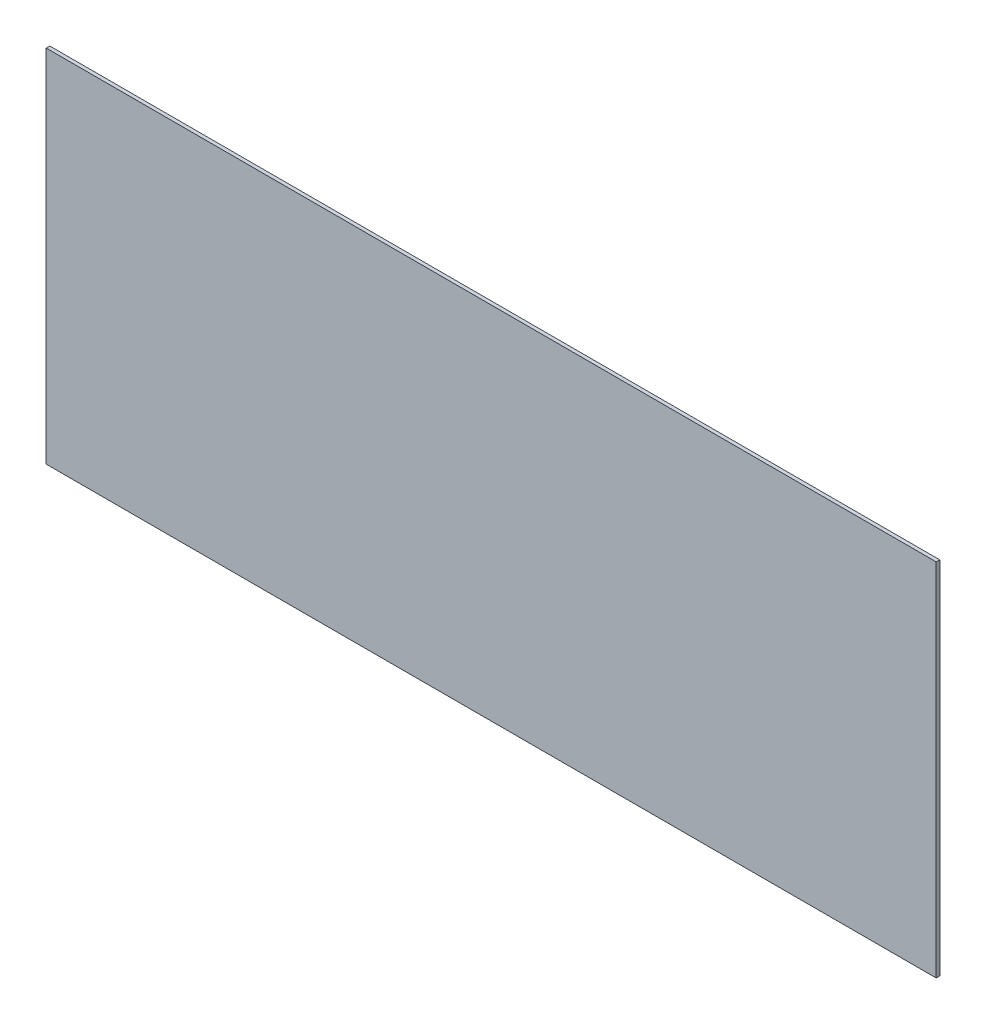
ISO-10303-21;
HEADER;
FILE_DESCRIPTION(('STEP AP214'),'2;1');
FILE_NAME('part.step','',(''),(''),'','','');
FILE_SCHEMA(('AUTOMOTIVE_DESIGN { 1 0 10303 214 1 1 1 1 }'));
ENDSEC;
DATA;
#1=APPLICATION_CONTEXT('core data for automotive mechanical design processes');
#2=APPLICATION_PROTOCOL_DEFINITION('international standard','automotive_design',2000,#1);
#3=PRODUCT_CONTEXT('',#1,'mechanical');
#4=PRODUCT('Part','Part','',(#3));
#5=PRODUCT_RELATED_PRODUCT_CATEGORY('part','',(#4));
#6=PRODUCT_DEFINITION_FORMATION('','',#4);
#7=PRODUCT_DEFINITION_CONTEXT('part definition',#1,'design');
#8=PRODUCT_DEFINITION('design','',#6,#7);
#9=PRODUCT_DEFINITION_SHAPE('','',#8);
#10=(LENGTH_UNIT() NAMED_UNIT(*) SI_UNIT(.MILLI.,.METRE.));
#11=(NAMED_UNIT(*) PLANE_ANGLE_UNIT() SI_UNIT($,.RADIAN.));
#12=(NAMED_UNIT(*) SI_UNIT($,.STERADIAN.) SOLID_ANGLE_UNIT());
#13=UNCERTAINTY_MEASURE_WITH_UNIT(LENGTH_MEASURE(1.E-05),#10,'distance_accuracy_value','');
#14=(GEOMETRIC_REPRESENTATION_CONTEXT(3) GLOBAL_UNCERTAINTY_ASSIGNED_CONTEXT((#13)) GLOBAL_UNIT_ASSIGNED_CONTEXT((#10,
#11,#12)) REPRESENTATION_CONTEXT('',''));
#15=CARTESIAN_POINT('',(0.,0.,0.));
#16=DIRECTION('',(0.,0.,1.));
#17=DIRECTION('',(1.,0.,0.));
#18=AXIS2_PLACEMENT_3D('',#15,#16,#17);
#19=CARTESIAN_POINT('',(-250.,101.23,2.));
#20=DIRECTION('',(1.,0.,0.));
#21=DIRECTION('',(0.,0.,-1.));
#22=AXIS2_PLACEMENT_3D('',#19,#20,#21);
#23=PLANE('',#22);
#24=DIRECTION('',(0.,-1.,0.));
#25=VECTOR('',#24,1.);
#26=CARTESIAN_POINT('',(-250.,101.23,0.));
#27=LINE('',#26,#25);
#28=CARTESIAN_POINT('',(-250.,101.23,0.));
#29=VERTEX_POINT('',#28);
#30=CARTESIAN_POINT('',(-250.,-101.23,0.));
#31=VERTEX_POINT('',#30);
#32=EDGE_CURVE('E94',#29,#31,#27,.T.);
#33=ORIENTED_EDGE('',*,*,#32,.T.);
#34=DIRECTION('',(0.,0.,-1.));
#35=VECTOR('',#34,1.);
#36=CARTESIAN_POINT('',(-250.,-101.23,2.));
#37=LINE('',#36,#35);
#38=CARTESIAN_POINT('',(-250.,-101.23,2.));
#39=VERTEX_POINT('',#38);
#40=EDGE_CURVE('E11',#39,#31,#37,.T.);
#41=ORIENTED_EDGE('',*,*,#40,.F.);
#42=DIRECTION('',(0.,-1.,0.));
#43=VECTOR('',#42,1.);
#44=CARTESIAN_POINT('',(-250.,101.23,2.));
#45=LINE('',#44,#43);
#46=CARTESIAN_POINT('',(-250.,101.23,2.));
#47=VERTEX_POINT('',#46);
#48=EDGE_CURVE('E82',#47,#39,#45,.T.);
#49=ORIENTED_EDGE('',*,*,#48,.F.);
#50=DIRECTION('',(0.,0.,-1.));
#51=VECTOR('',#50,1.);
#52=CARTESIAN_POINT('',(-250.,101.23,2.));
#53=LINE('',#52,#51);
#54=EDGE_CURVE('E90',#47,#29,#53,.T.);
#55=ORIENTED_EDGE('',*,*,#54,.T.);
#56=EDGE_LOOP('',(#33,#41,#49,#55));
#57=FACE_BOUND('',#56,.T.);
#58=ADVANCED_FACE('F31',(#57),#23,.F.);
#59=CARTESIAN_POINT('',(-250.,-101.23,2.));
#60=DIRECTION('',(0.,1.,0.));
#61=DIRECTION('',(0.,0.,1.));
#62=AXIS2_PLACEMENT_3D('',#59,#60,#61);
#63=PLANE('',#62);
#64=DIRECTION('',(1.,0.,0.));
#65=VECTOR('',#64,1.);
#66=CARTESIAN_POINT('',(-250.,-101.23,0.));
#67=LINE('',#66,#65);
#68=CARTESIAN_POINT('',(250.,-101.23,0.));
#69=VERTEX_POINT('',#68);
#70=EDGE_CURVE('E86',#31,#69,#67,.T.);
#71=ORIENTED_EDGE('',*,*,#70,.T.);
#72=DIRECTION('',(0.,0.,-1.));
#73=VECTOR('',#72,1.);
#74=CARTESIAN_POINT('',(250.,-101.23,2.));
#75=LINE('',#74,#73);
#76=CARTESIAN_POINT('',(250.,-101.23,2.));
#77=VERTEX_POINT('',#76);
#78=EDGE_CURVE('E39',#77,#69,#75,.T.);
#79=ORIENTED_EDGE('',*,*,#78,.F.);
#80=DIRECTION('',(1.,0.,0.));
#81=VECTOR('',#80,1.);
#82=CARTESIAN_POINT('',(-250.,-101.23,2.));
#83=LINE('',#82,#81);
#84=EDGE_CURVE('E77',#39,#77,#83,.T.);
#85=ORIENTED_EDGE('',*,*,#84,.F.);
#86=ORIENTED_EDGE('',*,*,#40,.T.);
#87=EDGE_LOOP('',(#71,#79,#85,#86));
#88=FACE_BOUND('',#87,.T.);
#89=ADVANCED_FACE('F85',(#88),#63,.F.);
#90=CARTESIAN_POINT('',(250.,101.23,2.));
#91=DIRECTION('',(-1.,0.,0.));
#92=DIRECTION('',(0.,-1.,0.));
#93=AXIS2_PLACEMENT_3D('',#90,#91,#92);
#94=PLANE('',#93);
#95=DIRECTION('',(0.,1.,0.));
#96=VECTOR('',#95,1.);
#97=CARTESIAN_POINT('',(250.,101.23,0.));
#98=LINE('',#97,#96);
#99=CARTESIAN_POINT('',(250.,101.23,0.));
#100=VERTEX_POINT('',#99);
#101=EDGE_CURVE('E64',#69,#100,#98,.T.);
#102=ORIENTED_EDGE('',*,*,#101,.T.);
#103=DIRECTION('',(0.,0.,-1.));
#104=VECTOR('',#103,1.);
#105=CARTESIAN_POINT('',(250.,101.23,2.));
#106=LINE('',#105,#104);
#107=CARTESIAN_POINT('',(250.,101.23,2.));
#108=VERTEX_POINT('',#107);
#109=EDGE_CURVE('E87',#108,#100,#106,.T.);
#110=ORIENTED_EDGE('',*,*,#109,.F.);
#111=DIRECTION('',(0.,1.,0.));
#112=VECTOR('',#111,1.);
#113=CARTESIAN_POINT('',(250.,101.23,2.));
#114=LINE('',#113,#112);
#115=EDGE_CURVE('E80',#77,#108,#114,.T.);
#116=ORIENTED_EDGE('',*,*,#115,.F.);
#117=ORIENTED_EDGE('',*,*,#78,.T.);
#118=EDGE_LOOP('',(#102,#110,#116,#117));
#119=FACE_BOUND('',#118,.T.);
#120=ADVANCED_FACE('F88',(#119),#94,.F.);
#121=CARTESIAN_POINT('',(-250.,101.23,2.));
#122=DIRECTION('',(0.,-1.,0.));
#123=DIRECTION('',(0.,0.,-1.));
#124=AXIS2_PLACEMENT_3D('',#121,#122,#123);
#125=PLANE('',#124);
#126=DIRECTION('',(-1.,0.,0.));
#127=VECTOR('',#126,1.);
#128=CARTESIAN_POINT('',(-250.,101.23,0.));
#129=LINE('',#128,#127);
#130=EDGE_CURVE('E70',#100,#29,#129,.T.);
#131=ORIENTED_EDGE('',*,*,#130,.T.);
#132=ORIENTED_EDGE('',*,*,#54,.F.);
#133=DIRECTION('',(-1.,0.,0.));
#134=VECTOR('',#133,1.);
#135=CARTESIAN_POINT('',(-250.,101.23,2.));
#136=LINE('',#135,#134);
#137=EDGE_CURVE('E47',#108,#47,#136,.T.);
#138=ORIENTED_EDGE('',*,*,#137,.F.);
#139=ORIENTED_EDGE('',*,*,#109,.T.);
#140=EDGE_LOOP('',(#131,#132,#138,#139));
#141=FACE_BOUND('',#140,.T.);
#142=ADVANCED_FACE('F101',(#141),#125,.F.);
#143=CARTESIAN_POINT('',(-250.,-101.23,2.));
#144=DIRECTION('',(0.,0.,1.));
#145=DIRECTION('',(1.,0.,0.));
#146=AXIS2_PLACEMENT_3D('',#143,#144,#145);
#147=PLANE('',#146);
#148=ORIENTED_EDGE('',*,*,#48,.T.);
#149=ORIENTED_EDGE('',*,*,#84,.T.);
#150=ORIENTED_EDGE('',*,*,#115,.T.);
#151=ORIENTED_EDGE('',*,*,#137,.T.);
#152=EDGE_LOOP('',(#148,#149,#150,#151));
#153=FACE_BOUND('',#152,.T.);
#154=ADVANCED_FACE('F78',(#153),#147,.T.);
#155=CARTESIAN_POINT('',(-250.,-101.23,0.));
#156=DIRECTION('',(0.,0.,1.));
#157=DIRECTION('',(1.,0.,0.));
#158=AXIS2_PLACEMENT_3D('',#155,#156,#157);
#159=PLANE('',#158);
#160=ORIENTED_EDGE('',*,*,#32,.F.);
#161=ORIENTED_EDGE('',*,*,#130,.F.);
#162=ORIENTED_EDGE('',*,*,#101,.F.);
#163=ORIENTED_EDGE('',*,*,#70,.F.);
#164=EDGE_LOOP('',(#160,#161,#162,#163));
#165=FACE_BOUND('',#164,.T.);
#166=ADVANCED_FACE('F104',(#165),#159,.F.);
#167=CLOSED_SHELL('',(#58,#89,#120,#142,#154,#166));
#168=MANIFOLD_SOLID_BREP('B2',#167);
#169=ADVANCED_BREP_SHAPE_REPRESENTATION('',(#18,#168),#14);
#170=SHAPE_DEFINITION_REPRESENTATION(#9,#169);
ENDSEC;
END-ISO-10303-21;
